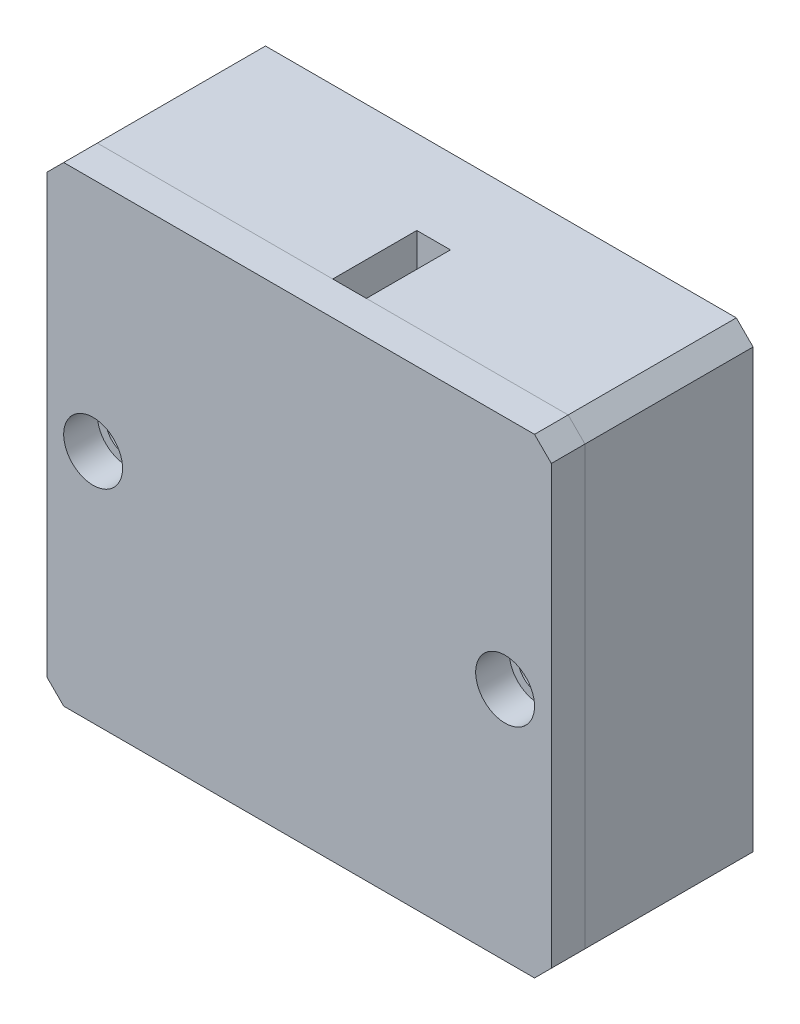
ISO-10303-21;
HEADER;
FILE_DESCRIPTION(('STEP AP214'),'2;1');
FILE_NAME('part.step','',(''),(''),'','','');
FILE_SCHEMA(('AUTOMOTIVE_DESIGN { 1 0 10303 214 1 1 1 1 }'));
ENDSEC;
DATA;
#1=APPLICATION_CONTEXT('core data for automotive mechanical design processes');
#2=APPLICATION_PROTOCOL_DEFINITION('international standard','automotive_design',2000,#1);
#3=PRODUCT_CONTEXT('',#1,'mechanical');
#4=PRODUCT('Part','Part','',(#3));
#5=PRODUCT_RELATED_PRODUCT_CATEGORY('part','',(#4));
#6=PRODUCT_DEFINITION_FORMATION('','',#4);
#7=PRODUCT_DEFINITION_CONTEXT('part definition',#1,'design');
#8=PRODUCT_DEFINITION('design','',#6,#7);
#9=PRODUCT_DEFINITION_SHAPE('','',#8);
#10=(LENGTH_UNIT() NAMED_UNIT(*) SI_UNIT(.MILLI.,.METRE.));
#11=(NAMED_UNIT(*) PLANE_ANGLE_UNIT() SI_UNIT($,.RADIAN.));
#12=(NAMED_UNIT(*) SI_UNIT($,.STERADIAN.) SOLID_ANGLE_UNIT());
#13=UNCERTAINTY_MEASURE_WITH_UNIT(LENGTH_MEASURE(1.E-05),#10,'distance_accuracy_value','');
#14=(GEOMETRIC_REPRESENTATION_CONTEXT(3) GLOBAL_UNCERTAINTY_ASSIGNED_CONTEXT((#13)) GLOBAL_UNIT_ASSIGNED_CONTEXT((#10,
#11,#12)) REPRESENTATION_CONTEXT('',''));
#15=CARTESIAN_POINT('',(0.,0.,0.));
#16=DIRECTION('',(0.,0.,1.));
#17=DIRECTION('',(1.,0.,0.));
#18=AXIS2_PLACEMENT_3D('',#15,#16,#17);
#19=CARTESIAN_POINT('',(0.,0.,10.));
#20=DIRECTION('',(0.,0.,1.));
#21=DIRECTION('',(1.,0.,0.));
#22=AXIS2_PLACEMENT_3D('',#19,#20,#21);
#23=PLANE('',#22);
#24=CARTESIAN_POINT('',(12.25,0.,10.));
#25=DIRECTION('',(0.,0.,1.));
#26=DIRECTION('',(1.,0.,0.));
#27=AXIS2_PLACEMENT_3D('',#24,#25,#26);
#28=CIRCLE('',#27,1.75);
#29=CARTESIAN_POINT('',(14.,0.,10.));
#30=VERTEX_POINT('',#29);
#31=EDGE_CURVE('E162',#30,#30,#28,.F.);
#32=ORIENTED_EDGE('',*,*,#31,.F.);
#33=EDGE_LOOP('',(#32));
#34=FACE_BOUND('',#33,.T.);
#35=CARTESIAN_POINT('',(-12.25,0.,10.));
#36=DIRECTION('',(0.,0.,1.));
#37=DIRECTION('',(1.,0.,0.));
#38=AXIS2_PLACEMENT_3D('',#35,#36,#37);
#39=CIRCLE('',#38,1.75);
#40=CARTESIAN_POINT('',(-10.5,0.,10.));
#41=VERTEX_POINT('',#40);
#42=EDGE_CURVE('E171',#41,#41,#39,.F.);
#43=ORIENTED_EDGE('',*,*,#42,.F.);
#44=EDGE_LOOP('',(#43));
#45=FACE_BOUND('',#44,.T.);
#46=DIRECTION('',(0.,-1.,0.));
#47=VECTOR('',#46,1.);
#48=CARTESIAN_POINT('',(9.,-14.,10.));
#49=LINE('',#48,#47);
#50=CARTESIAN_POINT('',(9.,9.,10.));
#51=VERTEX_POINT('',#50);
#52=CARTESIAN_POINT('',(9.,-14.,10.));
#53=VERTEX_POINT('',#52);
#54=EDGE_CURVE('E64',#51,#53,#49,.T.);
#55=ORIENTED_EDGE('',*,*,#54,.F.);
#56=DIRECTION('',(1.,0.,0.));
#57=VECTOR('',#56,1.);
#58=CARTESIAN_POINT('',(9.,9.,10.));
#59=LINE('',#58,#57);
#60=CARTESIAN_POINT('',(-9.,9.,10.));
#61=VERTEX_POINT('',#60);
#62=EDGE_CURVE('E156',#61,#51,#59,.T.);
#63=ORIENTED_EDGE('',*,*,#62,.F.);
#64=DIRECTION('',(0.,1.,0.));
#65=VECTOR('',#64,1.);
#66=CARTESIAN_POINT('',(-9.,-14.,10.));
#67=LINE('',#66,#65);
#68=CARTESIAN_POINT('',(-9.,-14.,10.));
#69=VERTEX_POINT('',#68);
#70=EDGE_CURVE('E415',#69,#61,#67,.T.);
#71=ORIENTED_EDGE('',*,*,#70,.F.);
#72=DIRECTION('',(1.,0.,0.));
#73=VECTOR('',#72,1.);
#74=CARTESIAN_POINT('',(-14.,-14.,10.));
#75=LINE('',#74,#73);
#76=CARTESIAN_POINT('',(-14.,-14.,10.));
#77=VERTEX_POINT('',#76);
#78=EDGE_CURVE('E204',#77,#69,#75,.T.);
#79=ORIENTED_EDGE('',*,*,#78,.F.);
#80=DIRECTION('',(0.707106781186546,-0.707106781186549,0.));
#81=VECTOR('',#80,1.);
#82=CARTESIAN_POINT('',(-15.,-13.,10.));
#83=LINE('',#82,#81);
#84=CARTESIAN_POINT('',(-15.,-13.,10.));
#85=VERTEX_POINT('',#84);
#86=EDGE_CURVE('E202',#85,#77,#83,.T.);
#87=ORIENTED_EDGE('',*,*,#86,.F.);
#88=DIRECTION('',(0.,-1.,0.));
#89=VECTOR('',#88,1.);
#90=CARTESIAN_POINT('',(-15.,13.,10.));
#91=LINE('',#90,#89);
#92=CARTESIAN_POINT('',(-15.,13.,10.));
#93=VERTEX_POINT('',#92);
#94=EDGE_CURVE('E200',#93,#85,#91,.T.);
#95=ORIENTED_EDGE('',*,*,#94,.F.);
#96=DIRECTION('',(-0.707106781186549,-0.707106781186546,0.));
#97=VECTOR('',#96,1.);
#98=CARTESIAN_POINT('',(-14.,14.,10.));
#99=LINE('',#98,#97);
#100=CARTESIAN_POINT('',(-14.,14.,10.));
#101=VERTEX_POINT('',#100);
#102=EDGE_CURVE('E198',#101,#93,#99,.T.);
#103=ORIENTED_EDGE('',*,*,#102,.F.);
#104=DIRECTION('',(-1.,0.,0.));
#105=VECTOR('',#104,1.);
#106=CARTESIAN_POINT('',(14.,14.,10.));
#107=LINE('',#106,#105);
#108=CARTESIAN_POINT('',(14.,14.,10.));
#109=VERTEX_POINT('',#108);
#110=EDGE_CURVE('E173',#109,#101,#107,.T.);
#111=ORIENTED_EDGE('',*,*,#110,.F.);
#112=DIRECTION('',(-0.707106781186547,0.707106781186548,0.));
#113=VECTOR('',#112,1.);
#114=CARTESIAN_POINT('',(15.,13.,10.));
#115=LINE('',#114,#113);
#116=CARTESIAN_POINT('',(15.,13.,10.));
#117=VERTEX_POINT('',#116);
#118=EDGE_CURVE('E181',#117,#109,#115,.T.);
#119=ORIENTED_EDGE('',*,*,#118,.F.);
#120=DIRECTION('',(0.,1.,0.));
#121=VECTOR('',#120,1.);
#122=CARTESIAN_POINT('',(15.,-13.,10.));
#123=LINE('',#122,#121);
#124=CARTESIAN_POINT('',(15.,-13.,10.));
#125=VERTEX_POINT('',#124);
#126=EDGE_CURVE('E208',#125,#117,#123,.T.);
#127=ORIENTED_EDGE('',*,*,#126,.F.);
#128=DIRECTION('',(0.707106781186549,0.707106781186546,0.));
#129=VECTOR('',#128,1.);
#130=CARTESIAN_POINT('',(14.,-14.,10.));
#131=LINE('',#130,#129);
#132=CARTESIAN_POINT('',(14.,-14.,10.));
#133=VERTEX_POINT('',#132);
#134=EDGE_CURVE('E206',#133,#125,#131,.T.);
#135=ORIENTED_EDGE('',*,*,#134,.F.);
#136=EDGE_CURVE('E69',#53,#133,#75,.T.);
#137=ORIENTED_EDGE('',*,*,#136,.F.);
#138=EDGE_LOOP('',(#55,#63,#71,#79,#87,#95,#103,#111,#119,#127,#135,#137));
#139=FACE_BOUND('',#138,.T.);
#140=ADVANCED_FACE('F49',(#34,#45,#139),#23,.F.);
#141=CARTESIAN_POINT('',(14.,14.,12.));
#142=DIRECTION('',(0.,-1.,0.));
#143=DIRECTION('',(0.,0.,-1.));
#144=AXIS2_PLACEMENT_3D('',#141,#142,#143);
#145=PLANE('',#144);
#146=ORIENTED_EDGE('',*,*,#110,.T.);
#147=DIRECTION('',(0.,0.,-1.));
#148=VECTOR('',#147,1.);
#149=CARTESIAN_POINT('',(-14.,14.,12.));
#150=LINE('',#149,#148);
#151=CARTESIAN_POINT('',(-14.,14.,12.));
#152=VERTEX_POINT('',#151);
#153=EDGE_CURVE('E12',#152,#101,#150,.T.);
#154=ORIENTED_EDGE('',*,*,#153,.F.);
#155=DIRECTION('',(-1.,0.,0.));
#156=VECTOR('',#155,1.);
#157=CARTESIAN_POINT('',(14.,14.,12.));
#158=LINE('',#157,#156);
#159=CARTESIAN_POINT('',(14.,14.,12.));
#160=VERTEX_POINT('',#159);
#161=EDGE_CURVE('E177',#160,#152,#158,.T.);
#162=ORIENTED_EDGE('',*,*,#161,.F.);
#163=DIRECTION('',(0.,0.,-1.));
#164=VECTOR('',#163,1.);
#165=CARTESIAN_POINT('',(14.,14.,12.));
#166=LINE('',#165,#164);
#167=EDGE_CURVE('E195',#160,#109,#166,.T.);
#168=ORIENTED_EDGE('',*,*,#167,.T.);
#169=EDGE_LOOP('',(#146,#154,#162,#168));
#170=FACE_BOUND('',#169,.T.);
#171=ADVANCED_FACE('F51',(#170),#145,.F.);
#172=CARTESIAN_POINT('',(-14.,14.,12.));
#173=DIRECTION('',(0.707106781186546,-0.707106781186549,0.));
#174=DIRECTION('',(0.707106781186549,0.707106781186546,0.));
#175=AXIS2_PLACEMENT_3D('',#172,#173,#174);
#176=PLANE('',#175);
#177=ORIENTED_EDGE('',*,*,#102,.T.);
#178=DIRECTION('',(0.,0.,-1.));
#179=VECTOR('',#178,1.);
#180=CARTESIAN_POINT('',(-15.,13.,12.));
#181=LINE('',#180,#179);
#182=CARTESIAN_POINT('',(-15.,13.,12.));
#183=VERTEX_POINT('',#182);
#184=EDGE_CURVE('E57',#183,#93,#181,.T.);
#185=ORIENTED_EDGE('',*,*,#184,.F.);
#186=DIRECTION('',(-0.707106781186549,-0.707106781186546,0.));
#187=VECTOR('',#186,1.);
#188=CARTESIAN_POINT('',(-14.,14.,12.));
#189=LINE('',#188,#187);
#190=EDGE_CURVE('E180',#152,#183,#189,.T.);
#191=ORIENTED_EDGE('',*,*,#190,.F.);
#192=ORIENTED_EDGE('',*,*,#153,.T.);
#193=EDGE_LOOP('',(#177,#185,#191,#192));
#194=FACE_BOUND('',#193,.T.);
#195=ADVANCED_FACE('F250',(#194),#176,.F.);
#196=CARTESIAN_POINT('',(-15.,13.,12.));
#197=DIRECTION('',(1.,0.,0.));
#198=DIRECTION('',(0.,1.,0.));
#199=AXIS2_PLACEMENT_3D('',#196,#197,#198);
#200=PLANE('',#199);
#201=ORIENTED_EDGE('',*,*,#94,.T.);
#202=DIRECTION('',(0.,0.,-1.));
#203=VECTOR('',#202,1.);
#204=CARTESIAN_POINT('',(-15.,-13.,12.));
#205=LINE('',#204,#203);
#206=CARTESIAN_POINT('',(-15.,-13.,12.));
#207=VERTEX_POINT('',#206);
#208=EDGE_CURVE('E225',#207,#85,#205,.T.);
#209=ORIENTED_EDGE('',*,*,#208,.F.);
#210=DIRECTION('',(0.,-1.,0.));
#211=VECTOR('',#210,1.);
#212=CARTESIAN_POINT('',(-15.,13.,12.));
#213=LINE('',#212,#211);
#214=EDGE_CURVE('E183',#183,#207,#213,.T.);
#215=ORIENTED_EDGE('',*,*,#214,.F.);
#216=ORIENTED_EDGE('',*,*,#184,.T.);
#217=EDGE_LOOP('',(#201,#209,#215,#216));
#218=FACE_BOUND('',#217,.T.);
#219=ADVANCED_FACE('F232',(#218),#200,.F.);
#220=CARTESIAN_POINT('',(-15.,-13.,12.));
#221=DIRECTION('',(0.707106781186549,0.707106781186546,0.));
#222=DIRECTION('',(-0.707106781186546,0.707106781186549,0.));
#223=AXIS2_PLACEMENT_3D('',#220,#221,#222);
#224=PLANE('',#223);
#225=ORIENTED_EDGE('',*,*,#86,.T.);
#226=DIRECTION('',(0.,0.,-1.));
#227=VECTOR('',#226,1.);
#228=CARTESIAN_POINT('',(-14.,-14.,12.));
#229=LINE('',#228,#227);
#230=CARTESIAN_POINT('',(-14.,-14.,12.));
#231=VERTEX_POINT('',#230);
#232=EDGE_CURVE('E222',#231,#77,#229,.T.);
#233=ORIENTED_EDGE('',*,*,#232,.F.);
#234=DIRECTION('',(0.707106781186546,-0.707106781186549,0.));
#235=VECTOR('',#234,1.);
#236=CARTESIAN_POINT('',(-15.,-13.,12.));
#237=LINE('',#236,#235);
#238=EDGE_CURVE('E185',#207,#231,#237,.T.);
#239=ORIENTED_EDGE('',*,*,#238,.F.);
#240=ORIENTED_EDGE('',*,*,#208,.T.);
#241=EDGE_LOOP('',(#225,#233,#239,#240));
#242=FACE_BOUND('',#241,.T.);
#243=ADVANCED_FACE('F240',(#242),#224,.F.);
#244=CARTESIAN_POINT('',(-14.,-14.,12.));
#245=DIRECTION('',(0.,1.,0.));
#246=DIRECTION('',(0.,0.,1.));
#247=AXIS2_PLACEMENT_3D('',#244,#245,#246);
#248=PLANE('',#247);
#249=ORIENTED_EDGE('',*,*,#78,.T.);
#250=DIRECTION('',(0.,0.,1.));
#251=VECTOR('',#250,1.);
#252=CARTESIAN_POINT('',(-9.,-14.,8.));
#253=LINE('',#252,#251);
#254=CARTESIAN_POINT('',(-9.,-14.,8.));
#255=VERTEX_POINT('',#254);
#256=EDGE_CURVE('E143',#255,#69,#253,.T.);
#257=ORIENTED_EDGE('',*,*,#256,.F.);
#258=DIRECTION('',(-1.,0.,0.));
#259=VECTOR('',#258,1.);
#260=CARTESIAN_POINT('',(9.,-14.,8.));
#261=LINE('',#260,#259);
#262=CARTESIAN_POINT('',(9.,-14.,8.));
#263=VERTEX_POINT('',#262);
#264=EDGE_CURVE('E136',#263,#255,#261,.T.);
#265=ORIENTED_EDGE('',*,*,#264,.F.);
#266=DIRECTION('',(0.,0.,1.));
#267=VECTOR('',#266,1.);
#268=CARTESIAN_POINT('',(9.,-14.,8.));
#269=LINE('',#268,#267);
#270=EDGE_CURVE('E141',#263,#53,#269,.T.);
#271=ORIENTED_EDGE('',*,*,#270,.T.);
#272=ORIENTED_EDGE('',*,*,#136,.T.);
#273=DIRECTION('',(0.,0.,-1.));
#274=VECTOR('',#273,1.);
#275=CARTESIAN_POINT('',(14.,-14.,12.));
#276=LINE('',#275,#274);
#277=CARTESIAN_POINT('',(14.,-14.,12.));
#278=VERTEX_POINT('',#277);
#279=EDGE_CURVE('E219',#278,#133,#276,.T.);
#280=ORIENTED_EDGE('',*,*,#279,.F.);
#281=DIRECTION('',(1.,0.,0.));
#282=VECTOR('',#281,1.);
#283=CARTESIAN_POINT('',(-14.,-14.,12.));
#284=LINE('',#283,#282);
#285=EDGE_CURVE('E187',#231,#278,#284,.T.);
#286=ORIENTED_EDGE('',*,*,#285,.F.);
#287=ORIENTED_EDGE('',*,*,#232,.T.);
#288=EDGE_LOOP('',(#249,#257,#265,#271,#272,#280,#286,#287));
#289=FACE_BOUND('',#288,.T.);
#290=ADVANCED_FACE('F139',(#289),#248,.F.);
#291=CARTESIAN_POINT('',(14.,-14.,12.));
#292=DIRECTION('',(-0.707106781186546,0.707106781186549,0.));
#293=DIRECTION('',(-0.707106781186549,-0.707106781186546,0.));
#294=AXIS2_PLACEMENT_3D('',#291,#292,#293);
#295=PLANE('',#294);
#296=ORIENTED_EDGE('',*,*,#134,.T.);
#297=DIRECTION('',(0.,0.,-1.));
#298=VECTOR('',#297,1.);
#299=CARTESIAN_POINT('',(15.,-13.,12.));
#300=LINE('',#299,#298);
#301=CARTESIAN_POINT('',(15.,-13.,12.));
#302=VERTEX_POINT('',#301);
#303=EDGE_CURVE('E216',#302,#125,#300,.T.);
#304=ORIENTED_EDGE('',*,*,#303,.F.);
#305=DIRECTION('',(0.707106781186549,0.707106781186546,0.));
#306=VECTOR('',#305,1.);
#307=CARTESIAN_POINT('',(14.,-14.,12.));
#308=LINE('',#307,#306);
#309=EDGE_CURVE('E189',#278,#302,#308,.T.);
#310=ORIENTED_EDGE('',*,*,#309,.F.);
#311=ORIENTED_EDGE('',*,*,#279,.T.);
#312=EDGE_LOOP('',(#296,#304,#310,#311));
#313=FACE_BOUND('',#312,.T.);
#314=ADVANCED_FACE('F263',(#313),#295,.F.);
#315=CARTESIAN_POINT('',(15.,-13.,12.));
#316=DIRECTION('',(-1.,0.,0.));
#317=DIRECTION('',(0.,-1.,0.));
#318=AXIS2_PLACEMENT_3D('',#315,#316,#317);
#319=PLANE('',#318);
#320=ORIENTED_EDGE('',*,*,#126,.T.);
#321=DIRECTION('',(0.,0.,-1.));
#322=VECTOR('',#321,1.);
#323=CARTESIAN_POINT('',(15.,13.,12.));
#324=LINE('',#323,#322);
#325=CARTESIAN_POINT('',(15.,13.,12.));
#326=VERTEX_POINT('',#325);
#327=EDGE_CURVE('E213',#326,#117,#324,.T.);
#328=ORIENTED_EDGE('',*,*,#327,.F.);
#329=DIRECTION('',(0.,1.,0.));
#330=VECTOR('',#329,1.);
#331=CARTESIAN_POINT('',(15.,-13.,12.));
#332=LINE('',#331,#330);
#333=EDGE_CURVE('E191',#302,#326,#332,.T.);
#334=ORIENTED_EDGE('',*,*,#333,.F.);
#335=ORIENTED_EDGE('',*,*,#303,.T.);
#336=EDGE_LOOP('',(#320,#328,#334,#335));
#337=FACE_BOUND('',#336,.T.);
#338=ADVANCED_FACE('F261',(#337),#319,.F.);
#339=CARTESIAN_POINT('',(15.,13.,12.));
#340=DIRECTION('',(-0.707106781186548,-0.707106781186547,0.));
#341=DIRECTION('',(0.707106781186547,-0.707106781186548,0.));
#342=AXIS2_PLACEMENT_3D('',#339,#340,#341);
#343=PLANE('',#342);
#344=ORIENTED_EDGE('',*,*,#118,.T.);
#345=ORIENTED_EDGE('',*,*,#167,.F.);
#346=DIRECTION('',(-0.707106781186547,0.707106781186548,0.));
#347=VECTOR('',#346,1.);
#348=CARTESIAN_POINT('',(15.,13.,12.));
#349=LINE('',#348,#347);
#350=EDGE_CURVE('E193',#326,#160,#349,.T.);
#351=ORIENTED_EDGE('',*,*,#350,.F.);
#352=ORIENTED_EDGE('',*,*,#327,.T.);
#353=EDGE_LOOP('',(#344,#345,#351,#352));
#354=FACE_BOUND('',#353,.T.);
#355=ADVANCED_FACE('F256',(#354),#343,.F.);
#356=CARTESIAN_POINT('',(0.,0.,12.));
#357=DIRECTION('',(0.,0.,1.));
#358=DIRECTION('',(1.,0.,0.));
#359=AXIS2_PLACEMENT_3D('',#356,#357,#358);
#360=PLANE('',#359);
#361=CARTESIAN_POINT('',(-12.25,0.,12.));
#362=DIRECTION('',(0.,0.,1.));
#363=DIRECTION('',(1.,0.,0.));
#364=AXIS2_PLACEMENT_3D('',#361,#362,#363);
#365=CIRCLE('',#364,1.75);
#366=CARTESIAN_POINT('',(-10.5,0.,12.));
#367=VERTEX_POINT('',#366);
#368=EDGE_CURVE('E168',#367,#367,#365,.T.);
#369=ORIENTED_EDGE('',*,*,#368,.F.);
#370=EDGE_LOOP('',(#369));
#371=FACE_BOUND('',#370,.T.);
#372=CARTESIAN_POINT('',(12.25,0.,12.));
#373=DIRECTION('',(0.,0.,1.));
#374=DIRECTION('',(1.,0.,0.));
#375=AXIS2_PLACEMENT_3D('',#372,#373,#374);
#376=CIRCLE('',#375,1.75);
#377=CARTESIAN_POINT('',(14.,0.,12.));
#378=VERTEX_POINT('',#377);
#379=EDGE_CURVE('E159',#378,#378,#376,.T.);
#380=ORIENTED_EDGE('',*,*,#379,.F.);
#381=EDGE_LOOP('',(#380));
#382=FACE_BOUND('',#381,.T.);
#383=ORIENTED_EDGE('',*,*,#161,.T.);
#384=ORIENTED_EDGE('',*,*,#190,.T.);
#385=ORIENTED_EDGE('',*,*,#214,.T.);
#386=ORIENTED_EDGE('',*,*,#238,.T.);
#387=ORIENTED_EDGE('',*,*,#285,.T.);
#388=ORIENTED_EDGE('',*,*,#309,.T.);
#389=ORIENTED_EDGE('',*,*,#333,.T.);
#390=ORIENTED_EDGE('',*,*,#350,.T.);
#391=EDGE_LOOP('',(#383,#384,#385,#386,#387,#388,#389,#390));
#392=FACE_BOUND('',#391,.T.);
#393=ADVANCED_FACE('F246',(#371,#382,#392),#360,.T.);
#394=CARTESIAN_POINT('',(12.25,0.,-0.000999999999999265));
#395=DIRECTION('',(0.,0.,1.));
#396=DIRECTION('',(1.,0.,0.));
#397=AXIS2_PLACEMENT_3D('',#394,#395,#396);
#398=CYLINDRICAL_SURFACE('',#397,1.75);
#399=ORIENTED_EDGE('',*,*,#379,.T.);
#400=EDGE_LOOP('',(#399));
#401=FACE_BOUND('',#400,.T.);
#402=ORIENTED_EDGE('',*,*,#31,.T.);
#403=EDGE_LOOP('',(#402));
#404=FACE_BOUND('',#403,.T.);
#405=ADVANCED_FACE('F287',(#401,#404),#398,.F.);
#406=CARTESIAN_POINT('',(-12.25,0.,-0.000999999999999265));
#407=DIRECTION('',(0.,0.,1.));
#408=DIRECTION('',(1.,0.,0.));
#409=AXIS2_PLACEMENT_3D('',#406,#407,#408);
#410=CYLINDRICAL_SURFACE('',#409,1.75);
#411=ORIENTED_EDGE('',*,*,#368,.T.);
#412=EDGE_LOOP('',(#411));
#413=FACE_BOUND('',#412,.T.);
#414=ORIENTED_EDGE('',*,*,#42,.T.);
#415=EDGE_LOOP('',(#414));
#416=FACE_BOUND('',#415,.T.);
#417=ADVANCED_FACE('F292',(#413,#416),#410,.F.);
#418=CARTESIAN_POINT('',(9.,-14.,8.));
#419=DIRECTION('',(-1.,0.,0.));
#420=DIRECTION('',(0.,0.,1.));
#421=AXIS2_PLACEMENT_3D('',#418,#419,#420);
#422=PLANE('',#421);
#423=ORIENTED_EDGE('',*,*,#54,.T.);
#424=ORIENTED_EDGE('',*,*,#270,.F.);
#425=DIRECTION('',(0.,-1.,0.));
#426=VECTOR('',#425,1.);
#427=CARTESIAN_POINT('',(9.,-14.,8.));
#428=LINE('',#427,#426);
#429=CARTESIAN_POINT('',(9.,9.,8.));
#430=VERTEX_POINT('',#429);
#431=EDGE_CURVE('E147',#430,#263,#428,.T.);
#432=ORIENTED_EDGE('',*,*,#431,.F.);
#433=DIRECTION('',(0.,0.,1.));
#434=VECTOR('',#433,1.);
#435=CARTESIAN_POINT('',(9.,9.,8.));
#436=LINE('',#435,#434);
#437=EDGE_CURVE('E412',#430,#51,#436,.T.);
#438=ORIENTED_EDGE('',*,*,#437,.T.);
#439=EDGE_LOOP('',(#423,#424,#432,#438));
#440=FACE_BOUND('',#439,.T.);
#441=ADVANCED_FACE('F158',(#440),#422,.F.);
#442=CARTESIAN_POINT('',(-9.,-14.,8.));
#443=DIRECTION('',(1.,0.,0.));
#444=DIRECTION('',(0.,0.,-1.));
#445=AXIS2_PLACEMENT_3D('',#442,#443,#444);
#446=PLANE('',#445);
#447=ORIENTED_EDGE('',*,*,#70,.T.);
#448=DIRECTION('',(0.,0.,1.));
#449=VECTOR('',#448,1.);
#450=CARTESIAN_POINT('',(-9.,9.,8.));
#451=LINE('',#450,#449);
#452=CARTESIAN_POINT('',(-9.,9.,8.));
#453=VERTEX_POINT('',#452);
#454=EDGE_CURVE('E164',#453,#61,#451,.T.);
#455=ORIENTED_EDGE('',*,*,#454,.F.);
#456=DIRECTION('',(0.,1.,0.));
#457=VECTOR('',#456,1.);
#458=CARTESIAN_POINT('',(-9.,-14.,8.));
#459=LINE('',#458,#457);
#460=EDGE_CURVE('E146',#255,#453,#459,.T.);
#461=ORIENTED_EDGE('',*,*,#460,.F.);
#462=ORIENTED_EDGE('',*,*,#256,.T.);
#463=EDGE_LOOP('',(#447,#455,#461,#462));
#464=FACE_BOUND('',#463,.T.);
#465=ADVANCED_FACE('F306',(#464),#446,.F.);
#466=CARTESIAN_POINT('',(9.,9.,8.));
#467=DIRECTION('',(0.,-1.,0.));
#468=DIRECTION('',(0.,0.,-1.));
#469=AXIS2_PLACEMENT_3D('',#466,#467,#468);
#470=PLANE('',#469);
#471=ORIENTED_EDGE('',*,*,#62,.T.);
#472=ORIENTED_EDGE('',*,*,#437,.F.);
#473=DIRECTION('',(1.,0.,0.));
#474=VECTOR('',#473,1.);
#475=CARTESIAN_POINT('',(9.,9.,8.));
#476=LINE('',#475,#474);
#477=EDGE_CURVE('E152',#453,#430,#476,.T.);
#478=ORIENTED_EDGE('',*,*,#477,.F.);
#479=ORIENTED_EDGE('',*,*,#454,.T.);
#480=EDGE_LOOP('',(#471,#472,#478,#479));
#481=FACE_BOUND('',#480,.T.);
#482=ADVANCED_FACE('F311',(#481),#470,.F.);
#483=CARTESIAN_POINT('',(0.,0.,8.));
#484=DIRECTION('',(0.,0.,1.));
#485=DIRECTION('',(1.,0.,0.));
#486=AXIS2_PLACEMENT_3D('',#483,#484,#485);
#487=PLANE('',#486);
#488=ORIENTED_EDGE('',*,*,#431,.T.);
#489=ORIENTED_EDGE('',*,*,#264,.T.);
#490=ORIENTED_EDGE('',*,*,#460,.T.);
#491=ORIENTED_EDGE('',*,*,#477,.T.);
#492=EDGE_LOOP('',(#488,#489,#490,#491));
#493=FACE_BOUND('',#492,.T.);
#494=ADVANCED_FACE('F150',(#493),#487,.F.);
#495=CLOSED_SHELL('',(#140,#171,#195,#219,#243,#290,#314,#338,#355,#393,#405,#417,#441,#465,
#482,#494));
#496=MANIFOLD_SOLID_BREP('B2',#495);
#497=CARTESIAN_POINT('',(0.,0.,5.));
#498=DIRECTION('',(0.,0.,1.));
#499=DIRECTION('',(1.,0.,0.));
#500=AXIS2_PLACEMENT_3D('',#497,#498,#499);
#501=PLANE('',#500);
#502=CARTESIAN_POINT('',(1.,10.8819660112501,5.));
#503=DIRECTION('',(0.,0.,1.));
#504=DIRECTION('',(1.,0.,0.));
#505=AXIS2_PLACEMENT_3D('',#502,#503,#504);
#506=CIRCLE('',#505,1.5);
#507=CARTESIAN_POINT('',(2.,12.,5.));
#508=VERTEX_POINT('',#507);
#509=CARTESIAN_POINT('',(0.,12.,5.));
#510=VERTEX_POINT('',#509);
#511=EDGE_CURVE('E593',#508,#510,#506,.T.);
#512=ORIENTED_EDGE('',*,*,#511,.F.);
#513=DIRECTION('',(0.,-1.,0.));
#514=VECTOR('',#513,1.);
#515=CARTESIAN_POINT('',(2.,14.,5.));
#516=LINE('',#515,#514);
#517=CARTESIAN_POINT('',(2.,14.,5.));
#518=VERTEX_POINT('',#517);
#519=EDGE_CURVE('E607',#518,#508,#516,.T.);
#520=ORIENTED_EDGE('',*,*,#519,.F.);
#521=DIRECTION('',(1.,0.,0.));
#522=VECTOR('',#521,1.);
#523=CARTESIAN_POINT('',(0.,14.,5.));
#524=LINE('',#523,#522);
#525=CARTESIAN_POINT('',(0.,14.,5.));
#526=VERTEX_POINT('',#525);
#527=EDGE_CURVE('E610',#526,#518,#524,.T.);
#528=ORIENTED_EDGE('',*,*,#527,.F.);
#529=DIRECTION('',(0.,1.,0.));
#530=VECTOR('',#529,1.);
#531=CARTESIAN_POINT('',(0.,14.,5.));
#532=LINE('',#531,#530);
#533=EDGE_CURVE('E613',#510,#526,#532,.T.);
#534=ORIENTED_EDGE('',*,*,#533,.F.);
#535=EDGE_LOOP('',(#512,#520,#528,#534));
#536=FACE_BOUND('',#535,.T.);
#537=ADVANCED_FACE('F425',(#536),#501,.T.);
#538=CARTESIAN_POINT('',(0.,0.,10.));
#539=DIRECTION('',(0.,0.,1.));
#540=DIRECTION('',(1.,0.,0.));
#541=AXIS2_PLACEMENT_3D('',#538,#539,#540);
#542=PLANE('',#541);
#543=CARTESIAN_POINT('',(12.25,0.,10.));
#544=DIRECTION('',(0.,0.,1.));
#545=DIRECTION('',(-1.,0.,0.));
#546=AXIS2_PLACEMENT_3D('',#543,#544,#545);
#547=CIRCLE('',#546,1.25);
#548=CARTESIAN_POINT('',(11.,0.,10.));
#549=VERTEX_POINT('',#548);
#550=EDGE_CURVE('E1007',#549,#549,#547,.T.);
#551=ORIENTED_EDGE('',*,*,#550,.F.);
#552=EDGE_LOOP('',(#551));
#553=FACE_BOUND('',#552,.T.);
#554=DIRECTION('',(0.,1.,0.));
#555=VECTOR('',#554,1.);
#556=CARTESIAN_POINT('',(15.,14.,10.));
#557=LINE('',#556,#555);
#558=CARTESIAN_POINT('',(15.,-13.,10.));
#559=VERTEX_POINT('',#558);
#560=CARTESIAN_POINT('',(15.,13.,10.));
#561=VERTEX_POINT('',#560);
#562=EDGE_CURVE('E643',#559,#561,#557,.T.);
#563=ORIENTED_EDGE('',*,*,#562,.T.);
#564=DIRECTION('',(0.707106781186547,-0.707106781186548,0.));
#565=VECTOR('',#564,1.);
#566=CARTESIAN_POINT('',(14.,14.,10.));
#567=LINE('',#566,#565);
#568=CARTESIAN_POINT('',(14.,14.,10.));
#569=VERTEX_POINT('',#568);
#570=EDGE_CURVE('E686',#561,#569,#567,.F.);
#571=ORIENTED_EDGE('',*,*,#570,.T.);
#572=DIRECTION('',(-1.,0.,0.));
#573=VECTOR('',#572,1.);
#574=CARTESIAN_POINT('',(-15.,14.,10.));
#575=LINE('',#574,#573);
#576=CARTESIAN_POINT('',(2.,14.,10.));
#577=VERTEX_POINT('',#576);
#578=EDGE_CURVE('E648',#569,#577,#575,.T.);
#579=ORIENTED_EDGE('',*,*,#578,.T.);
#580=DIRECTION('',(0.,1.,0.));
#581=VECTOR('',#580,1.);
#582=CARTESIAN_POINT('',(2.,14.,10.));
#583=LINE('',#582,#581);
#584=CARTESIAN_POINT('',(2.,12.,10.));
#585=VERTEX_POINT('',#584);
#586=EDGE_CURVE('E626',#585,#577,#583,.T.);
#587=ORIENTED_EDGE('',*,*,#586,.F.);
#588=DIRECTION('',(-1.,0.,0.));
#589=VECTOR('',#588,1.);
#590=CARTESIAN_POINT('',(2.,12.,10.));
#591=LINE('',#590,#589);
#592=CARTESIAN_POINT('',(9.5,12.,10.));
#593=VERTEX_POINT('',#592);
#594=EDGE_CURVE('E623',#593,#585,#591,.T.);
#595=ORIENTED_EDGE('',*,*,#594,.F.);
#596=DIRECTION('',(0.,1.,0.));
#597=VECTOR('',#596,1.);
#598=CARTESIAN_POINT('',(9.5,12.,10.));
#599=LINE('',#598,#597);
#600=CARTESIAN_POINT('',(9.5,-14.,10.));
#601=VERTEX_POINT('',#600);
#602=EDGE_CURVE('E620',#601,#593,#599,.T.);
#603=ORIENTED_EDGE('',*,*,#602,.F.);
#604=DIRECTION('',(1.,0.,0.));
#605=VECTOR('',#604,1.);
#606=CARTESIAN_POINT('',(-15.,-14.,10.));
#607=LINE('',#606,#605);
#608=CARTESIAN_POINT('',(14.,-14.,10.));
#609=VERTEX_POINT('',#608);
#610=EDGE_CURVE('E652',#601,#609,#607,.T.);
#611=ORIENTED_EDGE('',*,*,#610,.T.);
#612=DIRECTION('',(-0.707106781186549,-0.707106781186546,0.));
#613=VECTOR('',#612,1.);
#614=CARTESIAN_POINT('',(14.,-14.,10.));
#615=LINE('',#614,#613);
#616=EDGE_CURVE('E684',#609,#559,#615,.F.);
#617=ORIENTED_EDGE('',*,*,#616,.T.);
#618=EDGE_LOOP('',(#563,#571,#579,#587,#595,#603,#611,#617));
#619=FACE_BOUND('',#618,.T.);
#620=ADVANCED_FACE('F701',(#553,#619),#542,.T.);
#621=CARTESIAN_POINT('',(15.,14.,10.));
#622=DIRECTION('',(-1.,0.,0.));
#623=DIRECTION('',(0.,-1.,0.));
#624=AXIS2_PLACEMENT_3D('',#621,#622,#623);
#625=PLANE('',#624);
#626=DIRECTION('',(0.,1.,0.));
#627=VECTOR('',#626,1.);
#628=CARTESIAN_POINT('',(15.,14.,0.));
#629=LINE('',#628,#627);
#630=CARTESIAN_POINT('',(15.,-13.,0.));
#631=VERTEX_POINT('',#630);
#632=CARTESIAN_POINT('',(15.,13.,0.));
#633=VERTEX_POINT('',#632);
#634=EDGE_CURVE('E642',#631,#633,#629,.T.);
#635=ORIENTED_EDGE('',*,*,#634,.T.);
#636=DIRECTION('',(0.,0.,1.));
#637=VECTOR('',#636,1.);
#638=CARTESIAN_POINT('',(15.,13.,10.));
#639=LINE('',#638,#637);
#640=EDGE_CURVE('E682',#633,#561,#639,.T.);
#641=ORIENTED_EDGE('',*,*,#640,.T.);
#642=ORIENTED_EDGE('',*,*,#562,.F.);
#643=DIRECTION('',(0.,0.,-1.));
#644=VECTOR('',#643,1.);
#645=CARTESIAN_POINT('',(15.,-13.,10.));
#646=LINE('',#645,#644);
#647=EDGE_CURVE('E679',#559,#631,#646,.T.);
#648=ORIENTED_EDGE('',*,*,#647,.T.);
#649=EDGE_LOOP('',(#635,#641,#642,#648));
#650=FACE_BOUND('',#649,.T.);
#651=ADVANCED_FACE('F707',(#650),#625,.F.);
#652=CARTESIAN_POINT('',(-15.,14.,10.));
#653=DIRECTION('',(0.,-1.,0.));
#654=DIRECTION('',(0.,0.,-1.));
#655=AXIS2_PLACEMENT_3D('',#652,#653,#654);
#656=PLANE('',#655);
#657=ORIENTED_EDGE('',*,*,#578,.F.);
#658=DIRECTION('',(0.,0.,-1.));
#659=VECTOR('',#658,1.);
#660=CARTESIAN_POINT('',(14.,14.,10.));
#661=LINE('',#660,#659);
#662=CARTESIAN_POINT('',(14.,14.,0.));
#663=VERTEX_POINT('',#662);
#664=EDGE_CURVE('E668',#569,#663,#661,.T.);
#665=ORIENTED_EDGE('',*,*,#664,.T.);
#666=DIRECTION('',(-1.,0.,0.));
#667=VECTOR('',#666,1.);
#668=CARTESIAN_POINT('',(-15.,14.,0.));
#669=LINE('',#668,#667);
#670=CARTESIAN_POINT('',(-14.,14.,0.));
#671=VERTEX_POINT('',#670);
#672=EDGE_CURVE('E658',#663,#671,#669,.T.);
#673=ORIENTED_EDGE('',*,*,#672,.T.);
#674=DIRECTION('',(0.,0.,1.));
#675=VECTOR('',#674,1.);
#676=CARTESIAN_POINT('',(-14.,14.,10.));
#677=LINE('',#676,#675);
#678=CARTESIAN_POINT('',(-14.,14.,10.));
#679=VERTEX_POINT('',#678);
#680=EDGE_CURVE('E666',#671,#679,#677,.T.);
#681=ORIENTED_EDGE('',*,*,#680,.T.);
#682=CARTESIAN_POINT('',(0.,14.,10.));
#683=VERTEX_POINT('',#682);
#684=EDGE_CURVE('E646',#683,#679,#575,.T.);
#685=ORIENTED_EDGE('',*,*,#684,.F.);
#686=DIRECTION('',(0.,0.,1.));
#687=VECTOR('',#686,1.);
#688=CARTESIAN_POINT('',(0.,14.,-33.8378486313773));
#689=LINE('',#688,#687);
#690=EDGE_CURVE('E629',#526,#683,#689,.T.);
#691=ORIENTED_EDGE('',*,*,#690,.F.);
#692=ORIENTED_EDGE('',*,*,#527,.T.);
#693=DIRECTION('',(0.,0.,1.));
#694=VECTOR('',#693,1.);
#695=CARTESIAN_POINT('',(2.,14.,-33.8378486313773));
#696=LINE('',#695,#694);
#697=EDGE_CURVE('E600',#518,#577,#696,.T.);
#698=ORIENTED_EDGE('',*,*,#697,.T.);
#699=EDGE_LOOP('',(#657,#665,#673,#681,#685,#691,#692,#698));
#700=FACE_BOUND('',#699,.T.);
#701=ADVANCED_FACE('F718',(#700),#656,.F.);
#702=CARTESIAN_POINT('',(-15.,14.,10.));
#703=DIRECTION('',(1.,0.,0.));
#704=DIRECTION('',(0.,1.,0.));
#705=AXIS2_PLACEMENT_3D('',#702,#703,#704);
#706=PLANE('',#705);
#707=DIRECTION('',(0.,-1.,0.));
#708=VECTOR('',#707,1.);
#709=CARTESIAN_POINT('',(-15.,14.,10.));
#710=LINE('',#709,#708);
#711=CARTESIAN_POINT('',(-15.,13.,10.));
#712=VERTEX_POINT('',#711);
#713=CARTESIAN_POINT('',(-15.,-13.,10.));
#714=VERTEX_POINT('',#713);
#715=EDGE_CURVE('E650',#712,#714,#710,.T.);
#716=ORIENTED_EDGE('',*,*,#715,.F.);
#717=DIRECTION('',(0.,0.,-1.));
#718=VECTOR('',#717,1.);
#719=CARTESIAN_POINT('',(-15.,13.,10.));
#720=LINE('',#719,#718);
#721=CARTESIAN_POINT('',(-15.,13.,0.));
#722=VERTEX_POINT('',#721);
#723=EDGE_CURVE('E689',#712,#722,#720,.T.);
#724=ORIENTED_EDGE('',*,*,#723,.T.);
#725=DIRECTION('',(0.,-1.,0.));
#726=VECTOR('',#725,1.);
#727=CARTESIAN_POINT('',(-15.,14.,0.));
#728=LINE('',#727,#726);
#729=CARTESIAN_POINT('',(-15.,-13.,0.));
#730=VERTEX_POINT('',#729);
#731=EDGE_CURVE('E661',#722,#730,#728,.T.);
#732=ORIENTED_EDGE('',*,*,#731,.T.);
#733=DIRECTION('',(0.,0.,1.));
#734=VECTOR('',#733,1.);
#735=CARTESIAN_POINT('',(-15.,-13.,10.));
#736=LINE('',#735,#734);
#737=EDGE_CURVE('E448',#730,#714,#736,.T.);
#738=ORIENTED_EDGE('',*,*,#737,.T.);
#739=EDGE_LOOP('',(#716,#724,#732,#738));
#740=FACE_BOUND('',#739,.T.);
#741=ADVANCED_FACE('F752',(#740),#706,.F.);
#742=CARTESIAN_POINT('',(-15.,-14.,10.));
#743=DIRECTION('',(0.,1.,0.));
#744=DIRECTION('',(0.,0.,1.));
#745=AXIS2_PLACEMENT_3D('',#742,#743,#744);
#746=PLANE('',#745);
#747=CARTESIAN_POINT('',(-14.,-14.,10.));
#748=VERTEX_POINT('',#747);
#749=CARTESIAN_POINT('',(-9.5,-14.,10.));
#750=VERTEX_POINT('',#749);
#751=EDGE_CURVE('E653',#748,#750,#607,.T.);
#752=ORIENTED_EDGE('',*,*,#751,.F.);
#753=DIRECTION('',(0.,0.,-1.));
#754=VECTOR('',#753,1.);
#755=CARTESIAN_POINT('',(-14.,-14.,10.));
#756=LINE('',#755,#754);
#757=CARTESIAN_POINT('',(-14.,-14.,0.));
#758=VERTEX_POINT('',#757);
#759=EDGE_CURVE('E47',#748,#758,#756,.T.);
#760=ORIENTED_EDGE('',*,*,#759,.T.);
#761=DIRECTION('',(1.,0.,0.));
#762=VECTOR('',#761,1.);
#763=CARTESIAN_POINT('',(-15.,-14.,0.));
#764=LINE('',#763,#762);
#765=CARTESIAN_POINT('',(14.,-14.,0.));
#766=VERTEX_POINT('',#765);
#767=EDGE_CURVE('E647',#758,#766,#764,.T.);
#768=ORIENTED_EDGE('',*,*,#767,.T.);
#769=DIRECTION('',(0.,0.,1.));
#770=VECTOR('',#769,1.);
#771=CARTESIAN_POINT('',(14.,-14.,10.));
#772=LINE('',#771,#770);
#773=EDGE_CURVE('E433',#766,#609,#772,.T.);
#774=ORIENTED_EDGE('',*,*,#773,.T.);
#775=ORIENTED_EDGE('',*,*,#610,.F.);
#776=DIRECTION('',(0.,0.,1.));
#777=VECTOR('',#776,1.);
#778=CARTESIAN_POINT('',(9.5,-14.,-33.8378486313773));
#779=LINE('',#778,#777);
#780=CARTESIAN_POINT('',(9.5,-14.,2.));
#781=VERTEX_POINT('',#780);
#782=EDGE_CURVE('E562',#781,#601,#779,.T.);
#783=ORIENTED_EDGE('',*,*,#782,.F.);
#784=DIRECTION('',(1.,0.,0.));
#785=VECTOR('',#784,1.);
#786=CARTESIAN_POINT('',(-9.5,-14.,2.));
#787=LINE('',#786,#785);
#788=CARTESIAN_POINT('',(-9.5,-14.,2.));
#789=VERTEX_POINT('',#788);
#790=EDGE_CURVE('E569',#789,#781,#787,.T.);
#791=ORIENTED_EDGE('',*,*,#790,.F.);
#792=DIRECTION('',(0.,0.,1.));
#793=VECTOR('',#792,1.);
#794=CARTESIAN_POINT('',(-9.5,-14.,-33.8378486313773));
#795=LINE('',#794,#793);
#796=EDGE_CURVE('E553',#789,#750,#795,.T.);
#797=ORIENTED_EDGE('',*,*,#796,.T.);
#798=EDGE_LOOP('',(#752,#760,#768,#774,#775,#783,#791,#797));
#799=FACE_BOUND('',#798,.T.);
#800=ADVANCED_FACE('F574',(#799),#746,.F.);
#801=CARTESIAN_POINT('',(-12.25,0.,10.));
#802=DIRECTION('',(0.,0.,1.));
#803=DIRECTION('',(1.,0.,0.));
#804=AXIS2_PLACEMENT_3D('',#801,#802,#803);
#805=CIRCLE('',#804,1.25);
#806=CARTESIAN_POINT('',(-11.,0.,10.));
#807=VERTEX_POINT('',#806);
#808=EDGE_CURVE('E1008',#807,#807,#805,.T.);
#809=ORIENTED_EDGE('',*,*,#808,.F.);
#810=EDGE_LOOP('',(#809));
#811=FACE_BOUND('',#810,.T.);
#812=ORIENTED_EDGE('',*,*,#684,.T.);
#813=DIRECTION('',(0.707106781186549,0.707106781186546,0.));
#814=VECTOR('',#813,1.);
#815=CARTESIAN_POINT('',(-14.,14.,10.));
#816=LINE('',#815,#814);
#817=EDGE_CURVE('E693',#679,#712,#816,.F.);
#818=ORIENTED_EDGE('',*,*,#817,.T.);
#819=ORIENTED_EDGE('',*,*,#715,.T.);
#820=DIRECTION('',(-0.707106781186546,0.707106781186549,0.));
#821=VECTOR('',#820,1.);
#822=CARTESIAN_POINT('',(-14.,-14.,10.));
#823=LINE('',#822,#821);
#824=EDGE_CURVE('E440',#714,#748,#823,.F.);
#825=ORIENTED_EDGE('',*,*,#824,.T.);
#826=ORIENTED_EDGE('',*,*,#751,.T.);
#827=DIRECTION('',(0.,-1.,0.));
#828=VECTOR('',#827,1.);
#829=CARTESIAN_POINT('',(-9.5,12.,10.));
#830=LINE('',#829,#828);
#831=CARTESIAN_POINT('',(-9.5,12.,10.));
#832=VERTEX_POINT('',#831);
#833=EDGE_CURVE('E559',#832,#750,#830,.T.);
#834=ORIENTED_EDGE('',*,*,#833,.F.);
#835=DIRECTION('',(-1.,0.,0.));
#836=VECTOR('',#835,1.);
#837=CARTESIAN_POINT('',(0.,12.,10.));
#838=LINE('',#837,#836);
#839=CARTESIAN_POINT('',(0.,12.,10.));
#840=VERTEX_POINT('',#839);
#841=EDGE_CURVE('E616',#840,#832,#838,.T.);
#842=ORIENTED_EDGE('',*,*,#841,.F.);
#843=DIRECTION('',(0.,-1.,0.));
#844=VECTOR('',#843,1.);
#845=CARTESIAN_POINT('',(0.,14.,10.));
#846=LINE('',#845,#844);
#847=EDGE_CURVE('E589',#683,#840,#846,.T.);
#848=ORIENTED_EDGE('',*,*,#847,.F.);
#849=EDGE_LOOP('',(#812,#818,#819,#825,#826,#834,#842,#848));
#850=FACE_BOUND('',#849,.T.);
#851=ADVANCED_FACE('F747',(#811,#850),#542,.T.);
#852=CARTESIAN_POINT('',(0.,0.,0.));
#853=DIRECTION('',(0.,0.,1.));
#854=DIRECTION('',(1.,0.,0.));
#855=AXIS2_PLACEMENT_3D('',#852,#853,#854);
#856=PLANE('',#855);
#857=ORIENTED_EDGE('',*,*,#672,.F.);
#858=DIRECTION('',(-0.707106781186547,0.707106781186548,0.));
#859=VECTOR('',#858,1.);
#860=CARTESIAN_POINT('',(14.,14.,0.));
#861=LINE('',#860,#859);
#862=EDGE_CURVE('E677',#663,#633,#861,.F.);
#863=ORIENTED_EDGE('',*,*,#862,.T.);
#864=ORIENTED_EDGE('',*,*,#634,.F.);
#865=DIRECTION('',(0.707106781186549,0.707106781186546,0.));
#866=VECTOR('',#865,1.);
#867=CARTESIAN_POINT('',(15.,-13.,0.));
#868=LINE('',#867,#866);
#869=EDGE_CURVE('E671',#631,#766,#868,.F.);
#870=ORIENTED_EDGE('',*,*,#869,.T.);
#871=ORIENTED_EDGE('',*,*,#767,.F.);
#872=DIRECTION('',(0.707106781186546,-0.707106781186549,0.));
#873=VECTOR('',#872,1.);
#874=CARTESIAN_POINT('',(-14.,-14.,0.));
#875=LINE('',#874,#873);
#876=EDGE_CURVE('E673',#758,#730,#875,.F.);
#877=ORIENTED_EDGE('',*,*,#876,.T.);
#878=ORIENTED_EDGE('',*,*,#731,.F.);
#879=DIRECTION('',(-0.707106781186549,-0.707106781186546,0.));
#880=VECTOR('',#879,1.);
#881=CARTESIAN_POINT('',(-15.,13.,0.));
#882=LINE('',#881,#880);
#883=EDGE_CURVE('E675',#722,#671,#882,.F.);
#884=ORIENTED_EDGE('',*,*,#883,.T.);
#885=EDGE_LOOP('',(#857,#863,#864,#870,#871,#877,#878,#884));
#886=FACE_BOUND('',#885,.T.);
#887=ADVANCED_FACE('F711',(#886),#856,.F.);
#888=CARTESIAN_POINT('',(2.,14.,-33.8378486313773));
#889=DIRECTION('',(1.,0.,0.));
#890=DIRECTION('',(0.,1.,0.));
#891=AXIS2_PLACEMENT_3D('',#888,#889,#890);
#892=PLANE('',#891);
#893=ORIENTED_EDGE('',*,*,#519,.T.);
#894=DIRECTION('',(0.,0.,1.));
#895=VECTOR('',#894,1.);
#896=CARTESIAN_POINT('',(2.,12.,-33.8378486313773));
#897=LINE('',#896,#895);
#898=EDGE_CURVE('E632',#508,#585,#897,.T.);
#899=ORIENTED_EDGE('',*,*,#898,.T.);
#900=ORIENTED_EDGE('',*,*,#586,.T.);
#901=ORIENTED_EDGE('',*,*,#697,.F.);
#902=EDGE_LOOP('',(#893,#899,#900,#901));
#903=FACE_BOUND('',#902,.T.);
#904=ADVANCED_FACE('F723',(#903),#892,.F.);
#905=CARTESIAN_POINT('',(2.,12.,-33.8378486313773));
#906=DIRECTION('',(0.,1.,0.));
#907=DIRECTION('',(-1.,0.,0.));
#908=AXIS2_PLACEMENT_3D('',#905,#906,#907);
#909=PLANE('',#908);
#910=DIRECTION('',(1.,0.,0.));
#911=VECTOR('',#910,1.);
#912=CARTESIAN_POINT('',(2.,12.,5.));
#913=LINE('',#912,#911);
#914=CARTESIAN_POINT('',(9.5,12.,5.));
#915=VERTEX_POINT('',#914);
#916=EDGE_CURVE('E605',#508,#915,#913,.T.);
#917=ORIENTED_EDGE('',*,*,#916,.T.);
#918=DIRECTION('',(0.,0.,1.));
#919=VECTOR('',#918,1.);
#920=CARTESIAN_POINT('',(9.5,12.,-33.8378486313773));
#921=LINE('',#920,#919);
#922=EDGE_CURVE('E634',#915,#593,#921,.T.);
#923=ORIENTED_EDGE('',*,*,#922,.T.);
#924=ORIENTED_EDGE('',*,*,#594,.T.);
#925=ORIENTED_EDGE('',*,*,#898,.F.);
#926=EDGE_LOOP('',(#917,#923,#924,#925));
#927=FACE_BOUND('',#926,.T.);
#928=ADVANCED_FACE('F727',(#927),#909,.F.);
#929=CARTESIAN_POINT('',(9.5,12.,-33.8378486313773));
#930=DIRECTION('',(1.,0.,0.));
#931=DIRECTION('',(0.,1.,0.));
#932=AXIS2_PLACEMENT_3D('',#929,#930,#931);
#933=PLANE('',#932);
#934=DIRECTION('',(0.,-1.,0.));
#935=VECTOR('',#934,1.);
#936=CARTESIAN_POINT('',(9.5,12.,5.));
#937=LINE('',#936,#935);
#938=CARTESIAN_POINT('',(9.5,-5.,5.));
#939=VERTEX_POINT('',#938);
#940=EDGE_CURVE('E602',#915,#939,#937,.T.);
#941=ORIENTED_EDGE('',*,*,#940,.T.);
#942=DIRECTION('',(0.,0.,1.));
#943=VECTOR('',#942,1.);
#944=CARTESIAN_POINT('',(9.5,-5.,2.));
#945=LINE('',#944,#943);
#946=CARTESIAN_POINT('',(9.5,-5.,2.));
#947=VERTEX_POINT('',#946);
#948=EDGE_CURVE('E583',#947,#939,#945,.T.);
#949=ORIENTED_EDGE('',*,*,#948,.F.);
#950=DIRECTION('',(0.,1.,0.));
#951=VECTOR('',#950,1.);
#952=CARTESIAN_POINT('',(9.5,-14.,2.));
#953=LINE('',#952,#951);
#954=EDGE_CURVE('E577',#781,#947,#953,.T.);
#955=ORIENTED_EDGE('',*,*,#954,.F.);
#956=ORIENTED_EDGE('',*,*,#782,.T.);
#957=ORIENTED_EDGE('',*,*,#602,.T.);
#958=ORIENTED_EDGE('',*,*,#922,.F.);
#959=EDGE_LOOP('',(#941,#949,#955,#956,#957,#958));
#960=FACE_BOUND('',#959,.T.);
#961=ADVANCED_FACE('F731',(#960),#933,.F.);
#962=CARTESIAN_POINT('',(-9.5,12.,-33.8378486313773));
#963=DIRECTION('',(-1.,0.,0.));
#964=DIRECTION('',(0.,-1.,0.));
#965=AXIS2_PLACEMENT_3D('',#962,#963,#964);
#966=PLANE('',#965);
#967=ORIENTED_EDGE('',*,*,#796,.F.);
#968=DIRECTION('',(0.,-1.,0.));
#969=VECTOR('',#968,1.);
#970=CARTESIAN_POINT('',(-9.5,-14.,2.));
#971=LINE('',#970,#969);
#972=CARTESIAN_POINT('',(-9.5,-5.,2.));
#973=VERTEX_POINT('',#972);
#974=EDGE_CURVE('E556',#973,#789,#971,.T.);
#975=ORIENTED_EDGE('',*,*,#974,.F.);
#976=DIRECTION('',(0.,0.,1.));
#977=VECTOR('',#976,1.);
#978=CARTESIAN_POINT('',(-9.5,-5.,2.));
#979=LINE('',#978,#977);
#980=CARTESIAN_POINT('',(-9.5,-5.,5.));
#981=VERTEX_POINT('',#980);
#982=EDGE_CURVE('E587',#973,#981,#979,.T.);
#983=ORIENTED_EDGE('',*,*,#982,.T.);
#984=DIRECTION('',(0.,1.,0.));
#985=VECTOR('',#984,1.);
#986=CARTESIAN_POINT('',(-9.5,12.,5.));
#987=LINE('',#986,#985);
#988=CARTESIAN_POINT('',(-9.5,12.,5.));
#989=VERTEX_POINT('',#988);
#990=EDGE_CURVE('E599',#981,#989,#987,.T.);
#991=ORIENTED_EDGE('',*,*,#990,.T.);
#992=DIRECTION('',(0.,0.,1.));
#993=VECTOR('',#992,1.);
#994=CARTESIAN_POINT('',(-9.5,12.,-33.8378486313773));
#995=LINE('',#994,#993);
#996=EDGE_CURVE('E563',#989,#832,#995,.T.);
#997=ORIENTED_EDGE('',*,*,#996,.T.);
#998=ORIENTED_EDGE('',*,*,#833,.T.);
#999=EDGE_LOOP('',(#967,#975,#983,#991,#997,#998));
#1000=FACE_BOUND('',#999,.T.);
#1001=ADVANCED_FACE('F555',(#1000),#966,.F.);
#1002=CARTESIAN_POINT('',(0.,12.,-33.8378486313773));
#1003=DIRECTION('',(0.,1.,0.));
#1004=DIRECTION('',(-1.,0.,0.));
#1005=AXIS2_PLACEMENT_3D('',#1002,#1003,#1004);
#1006=PLANE('',#1005);
#1007=DIRECTION('',(1.,0.,0.));
#1008=VECTOR('',#1007,1.);
#1009=CARTESIAN_POINT('',(0.,12.,5.));
#1010=LINE('',#1009,#1008);
#1011=EDGE_CURVE('E596',#989,#510,#1010,.T.);
#1012=ORIENTED_EDGE('',*,*,#1011,.T.);
#1013=DIRECTION('',(0.,0.,1.));
#1014=VECTOR('',#1013,1.);
#1015=CARTESIAN_POINT('',(0.,12.,-33.8378486313773));
#1016=LINE('',#1015,#1014);
#1017=EDGE_CURVE('E638',#510,#840,#1016,.T.);
#1018=ORIENTED_EDGE('',*,*,#1017,.T.);
#1019=ORIENTED_EDGE('',*,*,#841,.T.);
#1020=ORIENTED_EDGE('',*,*,#996,.F.);
#1021=EDGE_LOOP('',(#1012,#1018,#1019,#1020));
#1022=FACE_BOUND('',#1021,.T.);
#1023=ADVANCED_FACE('F743',(#1022),#1006,.F.);
#1024=CARTESIAN_POINT('',(0.,14.,-33.8378486313773));
#1025=DIRECTION('',(-1.,0.,0.));
#1026=DIRECTION('',(0.,-1.,0.));
#1027=AXIS2_PLACEMENT_3D('',#1024,#1025,#1026);
#1028=PLANE('',#1027);
#1029=ORIENTED_EDGE('',*,*,#533,.T.);
#1030=ORIENTED_EDGE('',*,*,#690,.T.);
#1031=ORIENTED_EDGE('',*,*,#847,.T.);
#1032=ORIENTED_EDGE('',*,*,#1017,.F.);
#1033=EDGE_LOOP('',(#1029,#1030,#1031,#1032));
#1034=FACE_BOUND('',#1033,.T.);
#1035=ADVANCED_FACE('F760',(#1034),#1028,.F.);
#1036=DIRECTION('',(-1.,0.,0.));
#1037=VECTOR('',#1036,1.);
#1038=CARTESIAN_POINT('',(-9.5,-5.,5.));
#1039=LINE('',#1038,#1037);
#1040=EDGE_CURVE('E572',#939,#981,#1039,.T.);
#1041=ORIENTED_EDGE('',*,*,#1040,.F.);
#1042=ORIENTED_EDGE('',*,*,#940,.F.);
#1043=ORIENTED_EDGE('',*,*,#916,.F.);
#1044=CARTESIAN_POINT('',(1.,10.8819660112501,5.));
#1045=DIRECTION('',(0.,0.,1.));
#1046=DIRECTION('',(1.,0.,0.));
#1047=AXIS2_PLACEMENT_3D('',#1044,#1045,#1046);
#1048=CIRCLE('',#1047,1.5);
#1049=EDGE_CURVE('E655',#510,#508,#1048,.T.);
#1050=ORIENTED_EDGE('',*,*,#1049,.F.);
#1051=ORIENTED_EDGE('',*,*,#1011,.F.);
#1052=ORIENTED_EDGE('',*,*,#990,.F.);
#1053=EDGE_LOOP('',(#1041,#1042,#1043,#1050,#1051,#1052));
#1054=FACE_BOUND('',#1053,.T.);
#1055=ADVANCED_FACE('F740',(#1054),#501,.T.);
#1056=CARTESIAN_POINT('',(1.,10.8819660112501,2.));
#1057=DIRECTION('',(0.,0.,1.));
#1058=DIRECTION('',(1.,0.,0.));
#1059=AXIS2_PLACEMENT_3D('',#1056,#1057,#1058);
#1060=CYLINDRICAL_SURFACE('',#1059,1.5);
#1061=CARTESIAN_POINT('',(1.,10.8819660112501,2.));
#1062=DIRECTION('',(0.,0.,1.));
#1063=DIRECTION('',(1.,0.,0.));
#1064=AXIS2_PLACEMENT_3D('',#1061,#1062,#1063);
#1065=CIRCLE('',#1064,1.5);
#1066=CARTESIAN_POINT('',(2.5,10.8819660112501,2.));
#1067=VERTEX_POINT('',#1066);
#1068=EDGE_CURVE('E586',#1067,#1067,#1065,.T.);
#1069=ORIENTED_EDGE('',*,*,#1068,.F.);
#1070=EDGE_LOOP('',(#1069));
#1071=FACE_BOUND('',#1070,.T.);
#1072=ORIENTED_EDGE('',*,*,#511,.T.);
#1073=ORIENTED_EDGE('',*,*,#1049,.T.);
#1074=EDGE_LOOP('',(#1072,#1073));
#1075=FACE_BOUND('',#1074,.T.);
#1076=ADVANCED_FACE('F766',(#1071,#1075),#1060,.F.);
#1077=CARTESIAN_POINT('',(1.,10.8819660112501,2.));
#1078=DIRECTION('',(0.,0.,1.));
#1079=DIRECTION('',(1.,0.,0.));
#1080=AXIS2_PLACEMENT_3D('',#1077,#1078,#1079);
#1081=PLANE('',#1080);
#1082=ORIENTED_EDGE('',*,*,#1068,.T.);
#1083=EDGE_LOOP('',(#1082));
#1084=FACE_BOUND('',#1083,.T.);
#1085=ADVANCED_FACE('F768',(#1084),#1081,.T.);
#1086=CARTESIAN_POINT('',(-9.5,-5.,2.));
#1087=DIRECTION('',(0.,1.,0.));
#1088=DIRECTION('',(0.,0.,1.));
#1089=AXIS2_PLACEMENT_3D('',#1086,#1087,#1088);
#1090=PLANE('',#1089);
#1091=ORIENTED_EDGE('',*,*,#1040,.T.);
#1092=ORIENTED_EDGE('',*,*,#982,.F.);
#1093=DIRECTION('',(-1.,0.,0.));
#1094=VECTOR('',#1093,1.);
#1095=CARTESIAN_POINT('',(-9.5,-5.,2.));
#1096=LINE('',#1095,#1094);
#1097=EDGE_CURVE('E571',#947,#973,#1096,.T.);
#1098=ORIENTED_EDGE('',*,*,#1097,.F.);
#1099=ORIENTED_EDGE('',*,*,#948,.T.);
#1100=EDGE_LOOP('',(#1091,#1092,#1098,#1099));
#1101=FACE_BOUND('',#1100,.T.);
#1102=ADVANCED_FACE('F733',(#1101),#1090,.F.);
#1103=CARTESIAN_POINT('',(0.,0.,2.));
#1104=DIRECTION('',(0.,0.,-1.));
#1105=DIRECTION('',(-1.,0.,0.));
#1106=AXIS2_PLACEMENT_3D('',#1103,#1104,#1105);
#1107=PLANE('',#1106);
#1108=ORIENTED_EDGE('',*,*,#974,.T.);
#1109=ORIENTED_EDGE('',*,*,#790,.T.);
#1110=ORIENTED_EDGE('',*,*,#954,.T.);
#1111=ORIENTED_EDGE('',*,*,#1097,.T.);
#1112=EDGE_LOOP('',(#1108,#1109,#1110,#1111));
#1113=FACE_BOUND('',#1112,.T.);
#1114=ADVANCED_FACE('F567',(#1113),#1107,.F.);
#1115=CARTESIAN_POINT('',(14.,14.,10.));
#1116=DIRECTION('',(-0.707106781186548,-0.707106781186547,0.));
#1117=DIRECTION('',(0.,0.,-1.));
#1118=AXIS2_PLACEMENT_3D('',#1115,#1116,#1117);
#1119=PLANE('',#1118);
#1120=ORIENTED_EDGE('',*,*,#570,.F.);
#1121=ORIENTED_EDGE('',*,*,#640,.F.);
#1122=ORIENTED_EDGE('',*,*,#862,.F.);
#1123=ORIENTED_EDGE('',*,*,#664,.F.);
#1124=EDGE_LOOP('',(#1120,#1121,#1122,#1123));
#1125=FACE_BOUND('',#1124,.T.);
#1126=ADVANCED_FACE('F715',(#1125),#1119,.F.);
#1127=CARTESIAN_POINT('',(-15.,13.,10.));
#1128=DIRECTION('',(0.707106781186546,-0.707106781186549,0.));
#1129=DIRECTION('',(0.,0.,-1.));
#1130=AXIS2_PLACEMENT_3D('',#1127,#1128,#1129);
#1131=PLANE('',#1130);
#1132=ORIENTED_EDGE('',*,*,#817,.F.);
#1133=ORIENTED_EDGE('',*,*,#680,.F.);
#1134=ORIENTED_EDGE('',*,*,#883,.F.);
#1135=ORIENTED_EDGE('',*,*,#723,.F.);
#1136=EDGE_LOOP('',(#1132,#1133,#1134,#1135));
#1137=FACE_BOUND('',#1136,.T.);
#1138=ADVANCED_FACE('F756',(#1137),#1131,.F.);
#1139=CARTESIAN_POINT('',(-14.,-14.,10.));
#1140=DIRECTION('',(0.707106781186549,0.707106781186546,0.));
#1141=DIRECTION('',(0.,0.,-1.));
#1142=AXIS2_PLACEMENT_3D('',#1139,#1140,#1141);
#1143=PLANE('',#1142);
#1144=ORIENTED_EDGE('',*,*,#824,.F.);
#1145=ORIENTED_EDGE('',*,*,#737,.F.);
#1146=ORIENTED_EDGE('',*,*,#876,.F.);
#1147=ORIENTED_EDGE('',*,*,#759,.F.);
#1148=EDGE_LOOP('',(#1144,#1145,#1146,#1147));
#1149=FACE_BOUND('',#1148,.T.);
#1150=ADVANCED_FACE('F750',(#1149),#1143,.F.);
#1151=CARTESIAN_POINT('',(15.,-13.,10.));
#1152=DIRECTION('',(-0.707106781186546,0.707106781186549,0.));
#1153=DIRECTION('',(0.,0.,-1.));
#1154=AXIS2_PLACEMENT_3D('',#1151,#1152,#1153);
#1155=PLANE('',#1154);
#1156=ORIENTED_EDGE('',*,*,#616,.F.);
#1157=ORIENTED_EDGE('',*,*,#773,.F.);
#1158=ORIENTED_EDGE('',*,*,#869,.F.);
#1159=ORIENTED_EDGE('',*,*,#647,.F.);
#1160=EDGE_LOOP('',(#1156,#1157,#1158,#1159));
#1161=FACE_BOUND('',#1160,.T.);
#1162=ADVANCED_FACE('F427',(#1161),#1155,.F.);
#1163=CARTESIAN_POINT('',(-12.25,0.,2.));
#1164=DIRECTION('',(0.,0.,1.));
#1165=DIRECTION('',(1.,0.,0.));
#1166=AXIS2_PLACEMENT_3D('',#1163,#1164,#1165);
#1167=CYLINDRICAL_SURFACE('',#1166,1.25);
#1168=CARTESIAN_POINT('',(-12.25,0.,2.));
#1169=DIRECTION('',(0.,0.,1.));
#1170=DIRECTION('',(1.,0.,0.));
#1171=AXIS2_PLACEMENT_3D('',#1168,#1169,#1170);
#1172=CIRCLE('',#1171,1.25);
#1173=CARTESIAN_POINT('',(-11.,0.,2.));
#1174=VERTEX_POINT('',#1173);
#1175=EDGE_CURVE('E595',#1174,#1174,#1172,.T.);
#1176=ORIENTED_EDGE('',*,*,#1175,.F.);
#1177=EDGE_LOOP('',(#1176));
#1178=FACE_BOUND('',#1177,.T.);
#1179=ORIENTED_EDGE('',*,*,#808,.T.);
#1180=EDGE_LOOP('',(#1179));
#1181=FACE_BOUND('',#1180,.T.);
#1182=ADVANCED_FACE('F817',(#1178,#1181),#1167,.F.);
#1183=CARTESIAN_POINT('',(-12.25,0.,2.));
#1184=DIRECTION('',(0.,0.,1.));
#1185=DIRECTION('',(1.,0.,0.));
#1186=AXIS2_PLACEMENT_3D('',#1183,#1184,#1185);
#1187=PLANE('',#1186);
#1188=ORIENTED_EDGE('',*,*,#1175,.T.);
#1189=EDGE_LOOP('',(#1188));
#1190=FACE_BOUND('',#1189,.T.);
#1191=ADVANCED_FACE('F821',(#1190),#1187,.T.);
#1192=CARTESIAN_POINT('',(12.25,0.,2.));
#1193=DIRECTION('',(0.,0.,1.));
#1194=DIRECTION('',(1.,0.,0.));
#1195=AXIS2_PLACEMENT_3D('',#1192,#1193,#1194);
#1196=CYLINDRICAL_SURFACE('',#1195,1.25);
#1197=CARTESIAN_POINT('',(12.25,0.,2.));
#1198=DIRECTION('',(0.,0.,1.));
#1199=DIRECTION('',(-1.,0.,0.));
#1200=AXIS2_PLACEMENT_3D('',#1197,#1198,#1199);
#1201=CIRCLE('',#1200,1.25);
#1202=CARTESIAN_POINT('',(11.,0.,2.));
#1203=VERTEX_POINT('',#1202);
#1204=EDGE_CURVE('E1004',#1203,#1203,#1201,.T.);
#1205=ORIENTED_EDGE('',*,*,#1204,.F.);
#1206=EDGE_LOOP('',(#1205));
#1207=FACE_BOUND('',#1206,.T.);
#1208=ORIENTED_EDGE('',*,*,#550,.T.);
#1209=EDGE_LOOP('',(#1208));
#1210=FACE_BOUND('',#1209,.T.);
#1211=ADVANCED_FACE('F827',(#1207,#1210),#1196,.F.);
#1212=CARTESIAN_POINT('',(12.25,0.,2.));
#1213=DIRECTION('',(0.,0.,-1.));
#1214=DIRECTION('',(-1.,0.,0.));
#1215=AXIS2_PLACEMENT_3D('',#1212,#1213,#1214);
#1216=PLANE('',#1215);
#1217=ORIENTED_EDGE('',*,*,#1204,.T.);
#1218=EDGE_LOOP('',(#1217));
#1219=FACE_BOUND('',#1218,.T.);
#1220=ADVANCED_FACE('F833',(#1219),#1216,.F.);
#1221=CLOSED_SHELL('',(#537,#620,#651,#701,#741,#800,#851,#887,#904,#928,#961,#1001,#1023,#1035,
#1055,#1076,#1085,#1102,#1114,#1126,#1138,#1150,#1162,#1182,#1191,#1211,#1220));
#1222=MANIFOLD_SOLID_BREP('B6',#1221);
#1223=ADVANCED_BREP_SHAPE_REPRESENTATION('',(#18,#496,#1222),#14);
#1224=SHAPE_DEFINITION_REPRESENTATION(#9,#1223);
ENDSEC;
END-ISO-10303-21;
